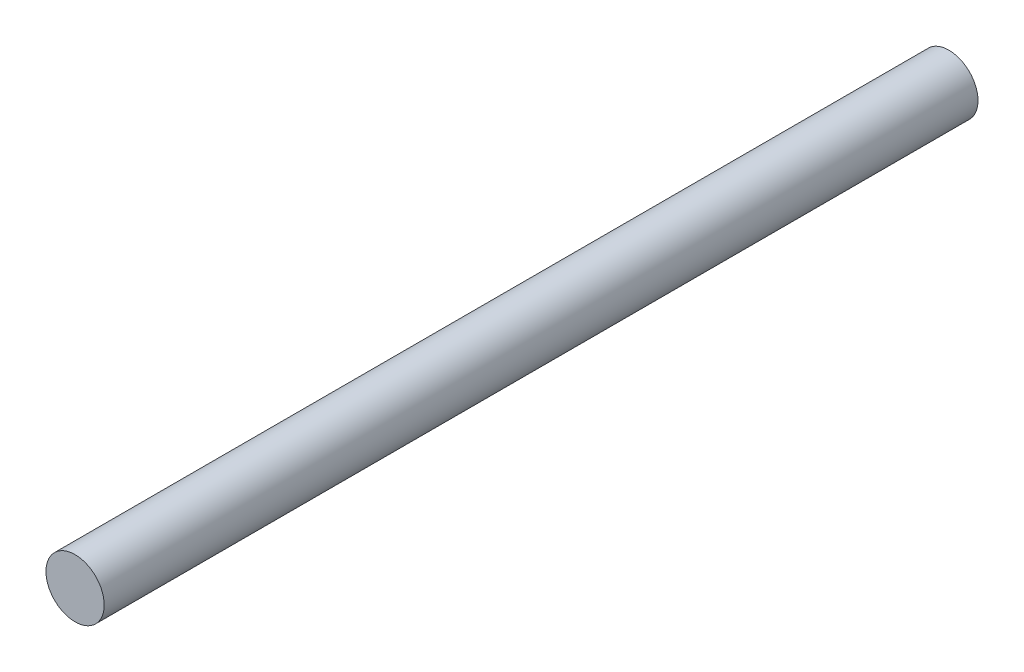
ISO-10303-21;
HEADER;
FILE_DESCRIPTION(('STEP AP214'),'2;1');
FILE_NAME('part.step','',(''),(''),'','','');
FILE_SCHEMA(('AUTOMOTIVE_DESIGN { 1 0 10303 214 1 1 1 1 }'));
ENDSEC;
DATA;
#1=APPLICATION_CONTEXT('core data for automotive mechanical design processes');
#2=APPLICATION_PROTOCOL_DEFINITION('international standard','automotive_design',2000,#1);
#3=PRODUCT_CONTEXT('',#1,'mechanical');
#4=PRODUCT('Part','Part','',(#3));
#5=PRODUCT_RELATED_PRODUCT_CATEGORY('part','',(#4));
#6=PRODUCT_DEFINITION_FORMATION('','',#4);
#7=PRODUCT_DEFINITION_CONTEXT('part definition',#1,'design');
#8=PRODUCT_DEFINITION('design','',#6,#7);
#9=PRODUCT_DEFINITION_SHAPE('','',#8);
#10=(LENGTH_UNIT() NAMED_UNIT(*) SI_UNIT(.MILLI.,.METRE.));
#11=(NAMED_UNIT(*) PLANE_ANGLE_UNIT() SI_UNIT($,.RADIAN.));
#12=(NAMED_UNIT(*) SI_UNIT($,.STERADIAN.) SOLID_ANGLE_UNIT());
#13=UNCERTAINTY_MEASURE_WITH_UNIT(LENGTH_MEASURE(1.E-05),#10,'distance_accuracy_value','');
#14=(GEOMETRIC_REPRESENTATION_CONTEXT(3) GLOBAL_UNCERTAINTY_ASSIGNED_CONTEXT((#13)) GLOBAL_UNIT_ASSIGNED_CONTEXT((#10,
#11,#12)) REPRESENTATION_CONTEXT('',''));
#15=CARTESIAN_POINT('',(0.,0.,0.));
#16=DIRECTION('',(0.,0.,1.));
#17=DIRECTION('',(1.,0.,0.));
#18=AXIS2_PLACEMENT_3D('',#15,#16,#17);
#19=CARTESIAN_POINT('',(0.,0.,-18.));
#20=DIRECTION('',(0.,0.,-1.));
#21=DIRECTION('',(-1.,0.,0.));
#22=AXIS2_PLACEMENT_3D('',#19,#20,#21);
#23=PLANE('',#22);
#24=CARTESIAN_POINT('',(-37.23906255414,-4.1,-18.));
#25=DIRECTION('',(0.,0.,-1.));
#26=DIRECTION('',(-1.,0.,0.));
#27=AXIS2_PLACEMENT_3D('',#24,#25,#26);
#28=CIRCLE('',#27,0.6);
#29=CARTESIAN_POINT('',(-37.83906255414,-4.1,-18.));
#30=VERTEX_POINT('',#29);
#31=EDGE_CURVE('E10',#30,#30,#28,.F.);
#32=ORIENTED_EDGE('',*,*,#31,.F.);
#33=EDGE_LOOP('',(#32));
#34=FACE_BOUND('',#33,.T.);
#35=ADVANCED_FACE('F41',(#34),#23,.T.);
#36=CARTESIAN_POINT('',(-37.23906255414,-4.1,0.));
#37=DIRECTION('',(0.,0.,1.));
#38=DIRECTION('',(1.,0.,0.));
#39=AXIS2_PLACEMENT_3D('',#36,#37,#38);
#40=PLANE('',#39);
#41=CARTESIAN_POINT('',(-37.23906255414,-4.1,0.));
#42=DIRECTION('',(0.,0.,1.));
#43=DIRECTION('',(1.,0.,0.));
#44=AXIS2_PLACEMENT_3D('',#41,#42,#43);
#45=CIRCLE('',#44,0.6);
#46=CARTESIAN_POINT('',(-36.63906255414,-4.1,0.));
#47=VERTEX_POINT('',#46);
#48=EDGE_CURVE('E47',#47,#47,#45,.T.);
#49=ORIENTED_EDGE('',*,*,#48,.T.);
#50=EDGE_LOOP('',(#49));
#51=FACE_BOUND('',#50,.T.);
#52=ADVANCED_FACE('F54',(#51),#40,.T.);
#53=CARTESIAN_POINT('',(-37.23906255414,-4.1,-19.6970562748477));
#54=DIRECTION('',(0.,0.,1.));
#55=DIRECTION('',(1.,0.,0.));
#56=AXIS2_PLACEMENT_3D('',#53,#54,#55);
#57=CYLINDRICAL_SURFACE('',#56,0.6);
#58=ORIENTED_EDGE('',*,*,#48,.F.);
#59=EDGE_LOOP('',(#58));
#60=FACE_BOUND('',#59,.T.);
#61=ORIENTED_EDGE('',*,*,#31,.T.);
#62=EDGE_LOOP('',(#61));
#63=FACE_BOUND('',#62,.T.);
#64=ADVANCED_FACE('F56',(#60,#63),#57,.T.);
#65=CLOSED_SHELL('',(#35,#52,#64));
#66=MANIFOLD_SOLID_BREP('B2',#65);
#67=ADVANCED_BREP_SHAPE_REPRESENTATION('',(#18,#66),#14);
#68=SHAPE_DEFINITION_REPRESENTATION(#9,#67);
ENDSEC;
END-ISO-10303-21;
